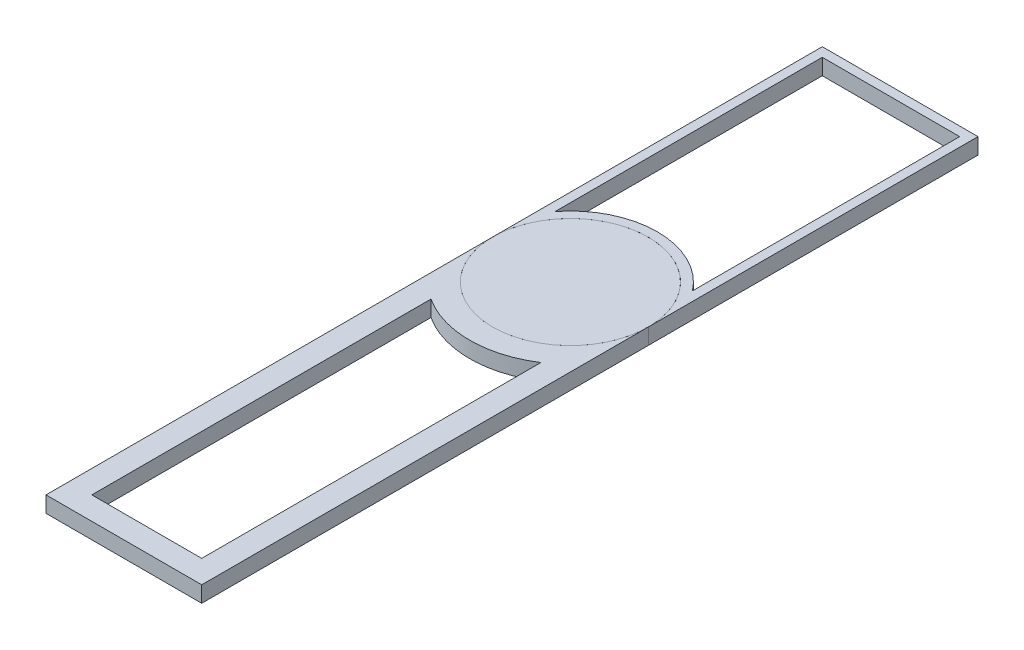
ISO-10303-21;
HEADER;
FILE_DESCRIPTION(('STEP AP214'),'2;1');
FILE_NAME('part.step','',(''),(''),'','','');
FILE_SCHEMA(('AUTOMOTIVE_DESIGN { 1 0 10303 214 1 1 1 1 }'));
ENDSEC;
DATA;
#1=APPLICATION_CONTEXT('core data for automotive mechanical design processes');
#2=APPLICATION_PROTOCOL_DEFINITION('international standard','automotive_design',2000,#1);
#3=PRODUCT_CONTEXT('',#1,'mechanical');
#4=PRODUCT('Part','Part','',(#3));
#5=PRODUCT_RELATED_PRODUCT_CATEGORY('part','',(#4));
#6=PRODUCT_DEFINITION_FORMATION('','',#4);
#7=PRODUCT_DEFINITION_CONTEXT('part definition',#1,'design');
#8=PRODUCT_DEFINITION('design','',#6,#7);
#9=PRODUCT_DEFINITION_SHAPE('','',#8);
#10=(LENGTH_UNIT() NAMED_UNIT(*) SI_UNIT(.MILLI.,.METRE.));
#11=(NAMED_UNIT(*) PLANE_ANGLE_UNIT() SI_UNIT($,.RADIAN.));
#12=(NAMED_UNIT(*) SI_UNIT($,.STERADIAN.) SOLID_ANGLE_UNIT());
#13=UNCERTAINTY_MEASURE_WITH_UNIT(LENGTH_MEASURE(1.E-05),#10,'distance_accuracy_value','');
#14=(GEOMETRIC_REPRESENTATION_CONTEXT(3) GLOBAL_UNCERTAINTY_ASSIGNED_CONTEXT((#13)) GLOBAL_UNIT_ASSIGNED_CONTEXT((#10,
#11,#12)) REPRESENTATION_CONTEXT('',''));
#15=CARTESIAN_POINT('',(0.,0.,0.));
#16=DIRECTION('',(0.,0.,1.));
#17=DIRECTION('',(1.,0.,0.));
#18=AXIS2_PLACEMENT_3D('',#15,#16,#17);
#19=CARTESIAN_POINT('',(17.,0.,-72.));
#20=DIRECTION('',(0.,1.,0.));
#21=DIRECTION('',(0.,0.,1.));
#22=AXIS2_PLACEMENT_3D('',#19,#20,#21);
#23=PLANE('',#22);
#24=DIRECTION('',(0.,0.,1.));
#25=VECTOR('',#24,1.);
#26=CARTESIAN_POINT('',(17.,0.,-72.));
#27=LINE('',#26,#25);
#28=CARTESIAN_POINT('',(17.,0.,-72.));
#29=VERTEX_POINT('',#28);
#30=CARTESIAN_POINT('',(17.,0.,0.));
#31=VERTEX_POINT('',#30);
#32=EDGE_CURVE('E12',#29,#31,#27,.T.);
#33=ORIENTED_EDGE('',*,*,#32,.T.);
#34=CARTESIAN_POINT('',(0.,0.,0.));
#35=DIRECTION('',(0.,-1.,0.));
#36=DIRECTION('',(0.,0.,-1.));
#37=AXIS2_PLACEMENT_3D('',#34,#35,#36);
#38=CIRCLE('',#37,17.);
#39=CARTESIAN_POINT('',(-17.,0.,0.));
#40=VERTEX_POINT('',#39);
#41=EDGE_CURVE('E152',#31,#40,#38,.F.);
#42=ORIENTED_EDGE('',*,*,#41,.T.);
#43=DIRECTION('',(0.,0.,1.));
#44=VECTOR('',#43,1.);
#45=CARTESIAN_POINT('',(-17.,0.,-72.));
#46=LINE('',#45,#44);
#47=CARTESIAN_POINT('',(-17.,0.,-72.));
#48=VERTEX_POINT('',#47);
#49=EDGE_CURVE('E64',#48,#40,#46,.T.);
#50=ORIENTED_EDGE('',*,*,#49,.F.);
#51=DIRECTION('',(-1.,0.,0.));
#52=VECTOR('',#51,1.);
#53=CARTESIAN_POINT('',(17.,0.,-72.));
#54=LINE('',#53,#52);
#55=EDGE_CURVE('E164',#29,#48,#54,.T.);
#56=ORIENTED_EDGE('',*,*,#55,.F.);
#57=EDGE_LOOP('',(#33,#42,#50,#56));
#58=FACE_BOUND('',#57,.T.);
#59=DIRECTION('',(0.,0.,1.));
#60=VECTOR('',#59,1.);
#61=CARTESIAN_POINT('',(15.,0.,-72.));
#62=LINE('',#61,#60);
#63=CARTESIAN_POINT('',(15.,0.,-70.));
#64=VERTEX_POINT('',#63);
#65=CARTESIAN_POINT('',(15.,0.,-11.6619037896906));
#66=VERTEX_POINT('',#65);
#67=EDGE_CURVE('E137',#64,#66,#62,.T.);
#68=ORIENTED_EDGE('',*,*,#67,.F.);
#69=DIRECTION('',(-1.,0.,0.));
#70=VECTOR('',#69,1.);
#71=CARTESIAN_POINT('',(0.,0.,-70.));
#72=LINE('',#71,#70);
#73=CARTESIAN_POINT('',(-15.,0.,-70.));
#74=VERTEX_POINT('',#73);
#75=EDGE_CURVE('E125',#64,#74,#72,.T.);
#76=ORIENTED_EDGE('',*,*,#75,.T.);
#77=DIRECTION('',(0.,0.,1.));
#78=VECTOR('',#77,1.);
#79=CARTESIAN_POINT('',(-15.,0.,-72.));
#80=LINE('',#79,#78);
#81=CARTESIAN_POINT('',(-15.,0.,-11.6619037896906));
#82=VERTEX_POINT('',#81);
#83=EDGE_CURVE('E122',#74,#82,#80,.T.);
#84=ORIENTED_EDGE('',*,*,#83,.T.);
#85=CARTESIAN_POINT('',(0.,0.,0.));
#86=DIRECTION('',(0.,1.,0.));
#87=DIRECTION('',(0.,0.,1.));
#88=AXIS2_PLACEMENT_3D('',#85,#86,#87);
#89=CIRCLE('',#88,19.);
#90=EDGE_CURVE('E145',#66,#82,#89,.T.);
#91=ORIENTED_EDGE('',*,*,#90,.F.);
#92=EDGE_LOOP('',(#68,#76,#84,#91));
#93=FACE_BOUND('',#92,.T.);
#94=ADVANCED_FACE('F56',(#58,#93),#23,.F.);
#95=CARTESIAN_POINT('',(17.,3.5,-72.));
#96=DIRECTION('',(0.,-1.,0.));
#97=DIRECTION('',(0.,0.,-1.));
#98=AXIS2_PLACEMENT_3D('',#95,#96,#97);
#99=PLANE('',#98);
#100=DIRECTION('',(0.,0.,1.));
#101=VECTOR('',#100,1.);
#102=CARTESIAN_POINT('',(-17.,3.5,-72.));
#103=LINE('',#102,#101);
#104=CARTESIAN_POINT('',(-17.,3.5,-72.));
#105=VERTEX_POINT('',#104);
#106=CARTESIAN_POINT('',(-17.,3.5,0.));
#107=VERTEX_POINT('',#106);
#108=EDGE_CURVE('E172',#105,#107,#103,.T.);
#109=ORIENTED_EDGE('',*,*,#108,.T.);
#110=CARTESIAN_POINT('',(0.,3.5,0.));
#111=DIRECTION('',(0.,1.,0.));
#112=DIRECTION('',(0.,0.,1.));
#113=AXIS2_PLACEMENT_3D('',#110,#111,#112);
#114=CIRCLE('',#113,17.);
#115=CARTESIAN_POINT('',(17.,3.5,0.));
#116=VERTEX_POINT('',#115);
#117=EDGE_CURVE('E156',#107,#116,#114,.F.);
#118=ORIENTED_EDGE('',*,*,#117,.T.);
#119=DIRECTION('',(0.,0.,1.));
#120=VECTOR('',#119,1.);
#121=CARTESIAN_POINT('',(17.,3.5,-72.));
#122=LINE('',#121,#120);
#123=CARTESIAN_POINT('',(17.,3.5,-72.));
#124=VERTEX_POINT('',#123);
#125=EDGE_CURVE('E170',#124,#116,#122,.T.);
#126=ORIENTED_EDGE('',*,*,#125,.F.);
#127=DIRECTION('',(1.,0.,0.));
#128=VECTOR('',#127,1.);
#129=CARTESIAN_POINT('',(17.,3.5,-72.));
#130=LINE('',#129,#128);
#131=EDGE_CURVE('E168',#105,#124,#130,.T.);
#132=ORIENTED_EDGE('',*,*,#131,.F.);
#133=EDGE_LOOP('',(#109,#118,#126,#132));
#134=FACE_BOUND('',#133,.T.);
#135=DIRECTION('',(0.,0.,1.));
#136=VECTOR('',#135,1.);
#137=CARTESIAN_POINT('',(-15.,3.5,-72.));
#138=LINE('',#137,#136);
#139=CARTESIAN_POINT('',(-15.,3.5,-70.));
#140=VERTEX_POINT('',#139);
#141=CARTESIAN_POINT('',(-15.,3.5,-11.6619037896906));
#142=VERTEX_POINT('',#141);
#143=EDGE_CURVE('E119',#140,#142,#138,.T.);
#144=ORIENTED_EDGE('',*,*,#143,.F.);
#145=DIRECTION('',(1.,0.,0.));
#146=VECTOR('',#145,1.);
#147=CARTESIAN_POINT('',(0.,3.5,-70.));
#148=LINE('',#147,#146);
#149=CARTESIAN_POINT('',(15.,3.5,-70.));
#150=VERTEX_POINT('',#149);
#151=EDGE_CURVE('E124',#140,#150,#148,.T.);
#152=ORIENTED_EDGE('',*,*,#151,.T.);
#153=DIRECTION('',(0.,0.,1.));
#154=VECTOR('',#153,1.);
#155=CARTESIAN_POINT('',(15.,3.5,-72.));
#156=LINE('',#155,#154);
#157=CARTESIAN_POINT('',(15.,3.5,-11.6619037896906));
#158=VERTEX_POINT('',#157);
#159=EDGE_CURVE('E131',#150,#158,#156,.T.);
#160=ORIENTED_EDGE('',*,*,#159,.T.);
#161=CARTESIAN_POINT('',(0.,3.5,0.));
#162=DIRECTION('',(0.,-1.,0.));
#163=DIRECTION('',(0.,0.,-1.));
#164=AXIS2_PLACEMENT_3D('',#161,#162,#163);
#165=CIRCLE('',#164,19.);
#166=EDGE_CURVE('E135',#142,#158,#165,.T.);
#167=ORIENTED_EDGE('',*,*,#166,.F.);
#168=EDGE_LOOP('',(#144,#152,#160,#167));
#169=FACE_BOUND('',#168,.T.);
#170=ADVANCED_FACE('F134',(#134,#169),#99,.F.);
#171=CARTESIAN_POINT('',(17.,0.,-72.));
#172=DIRECTION('',(-1.,0.,0.));
#173=DIRECTION('',(0.,0.,1.));
#174=AXIS2_PLACEMENT_3D('',#171,#172,#173);
#175=PLANE('',#174);
#176=ORIENTED_EDGE('',*,*,#125,.T.);
#177=DIRECTION('',(0.,-1.,0.));
#178=VECTOR('',#177,1.);
#179=CARTESIAN_POINT('',(17.,3.5,0.));
#180=LINE('',#179,#178);
#181=EDGE_CURVE('E144',#31,#116,#180,.F.);
#182=ORIENTED_EDGE('',*,*,#181,.F.);
#183=ORIENTED_EDGE('',*,*,#32,.F.);
#184=DIRECTION('',(0.,-1.,0.));
#185=VECTOR('',#184,1.);
#186=CARTESIAN_POINT('',(17.,0.,-72.));
#187=LINE('',#186,#185);
#188=EDGE_CURVE('E161',#124,#29,#187,.T.);
#189=ORIENTED_EDGE('',*,*,#188,.F.);
#190=EDGE_LOOP('',(#176,#182,#183,#189));
#191=FACE_BOUND('',#190,.T.);
#192=ADVANCED_FACE('F58',(#191),#175,.F.);
#193=CARTESIAN_POINT('',(-17.,0.,-72.));
#194=DIRECTION('',(1.,0.,0.));
#195=DIRECTION('',(0.,1.,0.));
#196=AXIS2_PLACEMENT_3D('',#193,#194,#195);
#197=PLANE('',#196);
#198=ORIENTED_EDGE('',*,*,#49,.T.);
#199=DIRECTION('',(0.,-1.,0.));
#200=VECTOR('',#199,1.);
#201=CARTESIAN_POINT('',(-17.,3.50000000000002,0.));
#202=LINE('',#201,#200);
#203=EDGE_CURVE('E153',#40,#107,#202,.F.);
#204=ORIENTED_EDGE('',*,*,#203,.T.);
#205=ORIENTED_EDGE('',*,*,#108,.F.);
#206=DIRECTION('',(0.,1.,0.));
#207=VECTOR('',#206,1.);
#208=CARTESIAN_POINT('',(-17.,0.,-72.));
#209=LINE('',#208,#207);
#210=EDGE_CURVE('E166',#48,#105,#209,.T.);
#211=ORIENTED_EDGE('',*,*,#210,.F.);
#212=EDGE_LOOP('',(#198,#204,#205,#211));
#213=FACE_BOUND('',#212,.T.);
#214=ADVANCED_FACE('F177',(#213),#197,.F.);
#215=CARTESIAN_POINT('',(0.,0.,-72.));
#216=DIRECTION('',(0.,0.,1.));
#217=DIRECTION('',(1.,0.,0.));
#218=AXIS2_PLACEMENT_3D('',#215,#216,#217);
#219=PLANE('',#218);
#220=ORIENTED_EDGE('',*,*,#188,.T.);
#221=ORIENTED_EDGE('',*,*,#55,.T.);
#222=ORIENTED_EDGE('',*,*,#210,.T.);
#223=ORIENTED_EDGE('',*,*,#131,.T.);
#224=EDGE_LOOP('',(#220,#221,#222,#223));
#225=FACE_BOUND('',#224,.T.);
#226=ADVANCED_FACE('F193',(#225),#219,.F.);
#227=CARTESIAN_POINT('',(0.,3.5,0.));
#228=DIRECTION('',(0.,-1.,0.));
#229=DIRECTION('',(0.,0.,-1.));
#230=AXIS2_PLACEMENT_3D('',#227,#228,#229);
#231=CYLINDRICAL_SURFACE('',#230,17.);
#232=ORIENTED_EDGE('',*,*,#41,.F.);
#233=ORIENTED_EDGE('',*,*,#181,.T.);
#234=ORIENTED_EDGE('',*,*,#117,.F.);
#235=ORIENTED_EDGE('',*,*,#203,.F.);
#236=EDGE_LOOP('',(#232,#233,#234,#235));
#237=FACE_BOUND('',#236,.T.);
#238=ADVANCED_FACE('F183',(#237),#231,.F.);
#239=CARTESIAN_POINT('',(15.,0.,-72.));
#240=DIRECTION('',(-1.,0.,0.));
#241=DIRECTION('',(0.,0.,1.));
#242=AXIS2_PLACEMENT_3D('',#239,#240,#241);
#243=PLANE('',#242);
#244=ORIENTED_EDGE('',*,*,#159,.F.);
#245=DIRECTION('',(0.,-1.,0.));
#246=VECTOR('',#245,1.);
#247=CARTESIAN_POINT('',(15.,0.,-70.));
#248=LINE('',#247,#246);
#249=EDGE_CURVE('E76',#150,#64,#248,.T.);
#250=ORIENTED_EDGE('',*,*,#249,.T.);
#251=ORIENTED_EDGE('',*,*,#67,.T.);
#252=DIRECTION('',(0.,-1.,0.));
#253=VECTOR('',#252,1.);
#254=CARTESIAN_POINT('',(15.,3.5,-11.6619037896906));
#255=LINE('',#254,#253);
#256=EDGE_CURVE('E147',#66,#158,#255,.F.);
#257=ORIENTED_EDGE('',*,*,#256,.T.);
#258=EDGE_LOOP('',(#244,#250,#251,#257));
#259=FACE_BOUND('',#258,.T.);
#260=ADVANCED_FACE('F200',(#259),#243,.T.);
#261=CARTESIAN_POINT('',(-15.,0.,-72.));
#262=DIRECTION('',(1.,0.,0.));
#263=DIRECTION('',(0.,1.,0.));
#264=AXIS2_PLACEMENT_3D('',#261,#262,#263);
#265=PLANE('',#264);
#266=ORIENTED_EDGE('',*,*,#83,.F.);
#267=DIRECTION('',(0.,1.,0.));
#268=VECTOR('',#267,1.);
#269=CARTESIAN_POINT('',(-15.,0.,-70.));
#270=LINE('',#269,#268);
#271=EDGE_CURVE('E71',#74,#140,#270,.T.);
#272=ORIENTED_EDGE('',*,*,#271,.T.);
#273=ORIENTED_EDGE('',*,*,#143,.T.);
#274=DIRECTION('',(0.,-1.,0.));
#275=VECTOR('',#274,1.);
#276=CARTESIAN_POINT('',(-15.,3.50000000000001,-11.6619037896906));
#277=LINE('',#276,#275);
#278=EDGE_CURVE('E142',#82,#142,#277,.F.);
#279=ORIENTED_EDGE('',*,*,#278,.F.);
#280=EDGE_LOOP('',(#266,#272,#273,#279));
#281=FACE_BOUND('',#280,.T.);
#282=ADVANCED_FACE('F117',(#281),#265,.T.);
#283=CARTESIAN_POINT('',(0.,0.,-70.));
#284=DIRECTION('',(0.,0.,1.));
#285=DIRECTION('',(1.,0.,0.));
#286=AXIS2_PLACEMENT_3D('',#283,#284,#285);
#287=PLANE('',#286);
#288=ORIENTED_EDGE('',*,*,#249,.F.);
#289=ORIENTED_EDGE('',*,*,#151,.F.);
#290=ORIENTED_EDGE('',*,*,#271,.F.);
#291=ORIENTED_EDGE('',*,*,#75,.F.);
#292=EDGE_LOOP('',(#288,#289,#290,#291));
#293=FACE_BOUND('',#292,.T.);
#294=ADVANCED_FACE('F128',(#293),#287,.T.);
#295=CARTESIAN_POINT('',(0.,3.5,0.));
#296=DIRECTION('',(0.,-1.,0.));
#297=DIRECTION('',(0.,0.,-1.));
#298=AXIS2_PLACEMENT_3D('',#295,#296,#297);
#299=CYLINDRICAL_SURFACE('',#298,19.);
#300=ORIENTED_EDGE('',*,*,#90,.T.);
#301=ORIENTED_EDGE('',*,*,#278,.T.);
#302=ORIENTED_EDGE('',*,*,#166,.T.);
#303=ORIENTED_EDGE('',*,*,#256,.F.);
#304=EDGE_LOOP('',(#300,#301,#302,#303));
#305=FACE_BOUND('',#304,.T.);
#306=ADVANCED_FACE('F266',(#305),#299,.T.);
#307=CLOSED_SHELL('',(#94,#170,#192,#214,#226,#238,#260,#282,#294,#306));
#308=MANIFOLD_SOLID_BREP('B2',#307);
#309=CARTESIAN_POINT('',(17.,3.5,-17.002));
#310=DIRECTION('',(0.,1.,0.));
#311=DIRECTION('',(-1.,0.,0.));
#312=AXIS2_PLACEMENT_3D('',#309,#310,#311);
#313=PLANE('',#312);
#314=CARTESIAN_POINT('',(0.,3.5,0.));
#315=DIRECTION('',(0.,1.,0.));
#316=DIRECTION('',(0.,0.,1.));
#317=AXIS2_PLACEMENT_3D('',#314,#315,#316);
#318=CIRCLE('',#317,17.);
#319=CARTESIAN_POINT('',(-17.,3.5,0.));
#320=VERTEX_POINT('',#319);
#321=CARTESIAN_POINT('',(17.,3.5,0.));
#322=VERTEX_POINT('',#321);
#323=EDGE_CURVE('E329',#320,#322,#318,.T.);
#324=ORIENTED_EDGE('',*,*,#323,.F.);
#325=DIRECTION('',(0.,0.,1.));
#326=VECTOR('',#325,1.);
#327=CARTESIAN_POINT('',(-17.,3.5,-17.002));
#328=LINE('',#327,#326);
#329=CARTESIAN_POINT('',(-17.,3.5,97.5));
#330=VERTEX_POINT('',#329);
#331=EDGE_CURVE('E450',#320,#330,#328,.T.);
#332=ORIENTED_EDGE('',*,*,#331,.T.);
#333=DIRECTION('',(-1.,0.,0.));
#334=VECTOR('',#333,1.);
#335=CARTESIAN_POINT('',(17.,3.5,97.5));
#336=LINE('',#335,#334);
#337=CARTESIAN_POINT('',(17.,3.5,97.5));
#338=VERTEX_POINT('',#337);
#339=EDGE_CURVE('E432',#338,#330,#336,.T.);
#340=ORIENTED_EDGE('',*,*,#339,.F.);
#341=DIRECTION('',(0.,0.,1.));
#342=VECTOR('',#341,1.);
#343=CARTESIAN_POINT('',(17.,3.5,-17.002));
#344=LINE('',#343,#342);
#345=EDGE_CURVE('E453',#322,#338,#344,.T.);
#346=ORIENTED_EDGE('',*,*,#345,.F.);
#347=EDGE_LOOP('',(#324,#332,#340,#346));
#348=FACE_BOUND('',#347,.T.);
#349=DIRECTION('',(0.,0.,1.));
#350=VECTOR('',#349,1.);
#351=CARTESIAN_POINT('',(-12.,3.5,-17.002));
#352=LINE('',#351,#350);
#353=CARTESIAN_POINT('',(-12.,3.5,18.4390889145858));
#354=VERTEX_POINT('',#353);
#355=CARTESIAN_POINT('',(-12.,3.5,92.5));
#356=VERTEX_POINT('',#355);
#357=EDGE_CURVE('E412',#354,#356,#352,.T.);
#358=ORIENTED_EDGE('',*,*,#357,.F.);
#359=CARTESIAN_POINT('',(0.,3.5,0.));
#360=DIRECTION('',(0.,1.,0.));
#361=DIRECTION('',(-1.,0.,0.));
#362=AXIS2_PLACEMENT_3D('',#359,#360,#361);
#363=CIRCLE('',#362,22.);
#364=CARTESIAN_POINT('',(12.,3.5,18.4390889145858));
#365=VERTEX_POINT('',#364);
#366=EDGE_CURVE('E393',#354,#365,#363,.T.);
#367=ORIENTED_EDGE('',*,*,#366,.T.);
#368=DIRECTION('',(0.,0.,1.));
#369=VECTOR('',#368,1.);
#370=CARTESIAN_POINT('',(12.,3.5,-17.002));
#371=LINE('',#370,#369);
#372=CARTESIAN_POINT('',(12.,3.5,92.5));
#373=VERTEX_POINT('',#372);
#374=EDGE_CURVE('E389',#365,#373,#371,.T.);
#375=ORIENTED_EDGE('',*,*,#374,.T.);
#376=DIRECTION('',(-1.,0.,0.));
#377=VECTOR('',#376,1.);
#378=CARTESIAN_POINT('',(17.,3.5,92.5));
#379=LINE('',#378,#377);
#380=EDGE_CURVE('E422',#373,#356,#379,.T.);
#381=ORIENTED_EDGE('',*,*,#380,.T.);
#382=EDGE_LOOP('',(#358,#367,#375,#381));
#383=FACE_BOUND('',#382,.T.);
#384=ADVANCED_FACE('F319',(#348,#383),#313,.T.);
#385=CARTESIAN_POINT('',(17.,0.,-17.002));
#386=DIRECTION('',(0.,-1.,0.));
#387=DIRECTION('',(0.,0.,-1.));
#388=AXIS2_PLACEMENT_3D('',#385,#386,#387);
#389=PLANE('',#388);
#390=DIRECTION('',(0.,0.,1.));
#391=VECTOR('',#390,1.);
#392=CARTESIAN_POINT('',(-17.,0.,-17.002));
#393=LINE('',#392,#391);
#394=CARTESIAN_POINT('',(-17.,0.,0.));
#395=VERTEX_POINT('',#394);
#396=CARTESIAN_POINT('',(-17.,0.,97.5));
#397=VERTEX_POINT('',#396);
#398=EDGE_CURVE('E447',#395,#397,#393,.T.);
#399=ORIENTED_EDGE('',*,*,#398,.F.);
#400=CARTESIAN_POINT('',(0.,0.,0.));
#401=DIRECTION('',(0.,1.,0.));
#402=DIRECTION('',(0.,0.,1.));
#403=AXIS2_PLACEMENT_3D('',#400,#401,#402);
#404=CIRCLE('',#403,17.);
#405=CARTESIAN_POINT('',(17.,0.,0.));
#406=VERTEX_POINT('',#405);
#407=EDGE_CURVE('E456',#395,#406,#404,.T.);
#408=ORIENTED_EDGE('',*,*,#407,.T.);
#409=DIRECTION('',(0.,0.,1.));
#410=VECTOR('',#409,1.);
#411=CARTESIAN_POINT('',(17.,0.,-17.002));
#412=LINE('',#411,#410);
#413=CARTESIAN_POINT('',(17.,0.,97.5));
#414=VERTEX_POINT('',#413);
#415=EDGE_CURVE('E444',#406,#414,#412,.T.);
#416=ORIENTED_EDGE('',*,*,#415,.T.);
#417=DIRECTION('',(1.,0.,0.));
#418=VECTOR('',#417,1.);
#419=CARTESIAN_POINT('',(17.,0.,97.5));
#420=LINE('',#419,#418);
#421=EDGE_CURVE('E440',#397,#414,#420,.T.);
#422=ORIENTED_EDGE('',*,*,#421,.F.);
#423=EDGE_LOOP('',(#399,#408,#416,#422));
#424=FACE_BOUND('',#423,.T.);
#425=CARTESIAN_POINT('',(0.,0.,0.));
#426=DIRECTION('',(0.,-1.,0.));
#427=DIRECTION('',(0.,0.,-1.));
#428=AXIS2_PLACEMENT_3D('',#425,#426,#427);
#429=CIRCLE('',#428,22.);
#430=CARTESIAN_POINT('',(-12.,0.,18.4390889145858));
#431=VERTEX_POINT('',#430);
#432=CARTESIAN_POINT('',(12.,0.,18.4390889145858));
#433=VERTEX_POINT('',#432);
#434=EDGE_CURVE('E394',#431,#433,#429,.F.);
#435=ORIENTED_EDGE('',*,*,#434,.F.);
#436=DIRECTION('',(0.,0.,1.));
#437=VECTOR('',#436,1.);
#438=CARTESIAN_POINT('',(-12.,0.,-17.002));
#439=LINE('',#438,#437);
#440=CARTESIAN_POINT('',(-12.,0.,92.5));
#441=VERTEX_POINT('',#440);
#442=EDGE_CURVE('E408',#431,#441,#439,.T.);
#443=ORIENTED_EDGE('',*,*,#442,.T.);
#444=DIRECTION('',(1.,0.,0.));
#445=VECTOR('',#444,1.);
#446=CARTESIAN_POINT('',(17.,0.,92.5));
#447=LINE('',#446,#445);
#448=CARTESIAN_POINT('',(12.,0.,92.5));
#449=VERTEX_POINT('',#448);
#450=EDGE_CURVE('E406',#441,#449,#447,.T.);
#451=ORIENTED_EDGE('',*,*,#450,.T.);
#452=DIRECTION('',(0.,0.,1.));
#453=VECTOR('',#452,1.);
#454=CARTESIAN_POINT('',(12.,0.,-17.002));
#455=LINE('',#454,#453);
#456=EDGE_CURVE('E386',#433,#449,#455,.T.);
#457=ORIENTED_EDGE('',*,*,#456,.F.);
#458=EDGE_LOOP('',(#435,#443,#451,#457));
#459=FACE_BOUND('',#458,.T.);
#460=ADVANCED_FACE('F405',(#424,#459),#389,.T.);
#461=CARTESIAN_POINT('',(0.,3.5,0.));
#462=DIRECTION('',(0.,-1.,0.));
#463=DIRECTION('',(0.,0.,-1.));
#464=AXIS2_PLACEMENT_3D('',#461,#462,#463);
#465=CYLINDRICAL_SURFACE('',#464,17.);
#466=ORIENTED_EDGE('',*,*,#407,.F.);
#467=DIRECTION('',(0.,-1.,0.));
#468=VECTOR('',#467,1.);
#469=CARTESIAN_POINT('',(-17.,3.5,0.));
#470=LINE('',#469,#468);
#471=EDGE_CURVE('E54',#395,#320,#470,.F.);
#472=ORIENTED_EDGE('',*,*,#471,.T.);
#473=ORIENTED_EDGE('',*,*,#323,.T.);
#474=DIRECTION('',(0.,-1.,0.));
#475=VECTOR('',#474,1.);
#476=CARTESIAN_POINT('',(17.,3.5,0.));
#477=LINE('',#476,#475);
#478=EDGE_CURVE('E323',#406,#322,#477,.F.);
#479=ORIENTED_EDGE('',*,*,#478,.F.);
#480=EDGE_LOOP('',(#466,#472,#473,#479));
#481=FACE_BOUND('',#480,.T.);
#482=ADVANCED_FACE('F321',(#481),#465,.F.);
#483=CARTESIAN_POINT('',(17.,3.5,-17.002));
#484=DIRECTION('',(1.,0.,0.));
#485=DIRECTION('',(0.,0.,-1.));
#486=AXIS2_PLACEMENT_3D('',#483,#484,#485);
#487=PLANE('',#486);
#488=ORIENTED_EDGE('',*,*,#415,.F.);
#489=ORIENTED_EDGE('',*,*,#478,.T.);
#490=ORIENTED_EDGE('',*,*,#345,.T.);
#491=DIRECTION('',(0.,1.,0.));
#492=VECTOR('',#491,1.);
#493=CARTESIAN_POINT('',(17.,3.5,97.5));
#494=LINE('',#493,#492);
#495=EDGE_CURVE('E428',#414,#338,#494,.T.);
#496=ORIENTED_EDGE('',*,*,#495,.F.);
#497=EDGE_LOOP('',(#488,#489,#490,#496));
#498=FACE_BOUND('',#497,.T.);
#499=ADVANCED_FACE('F468',(#498),#487,.T.);
#500=CARTESIAN_POINT('',(-17.,3.5,-17.002));
#501=DIRECTION('',(-1.,0.,0.));
#502=DIRECTION('',(0.,0.,1.));
#503=AXIS2_PLACEMENT_3D('',#500,#501,#502);
#504=PLANE('',#503);
#505=ORIENTED_EDGE('',*,*,#471,.F.);
#506=ORIENTED_EDGE('',*,*,#398,.T.);
#507=DIRECTION('',(0.,-1.,0.));
#508=VECTOR('',#507,1.);
#509=CARTESIAN_POINT('',(-17.,3.5,97.5));
#510=LINE('',#509,#508);
#511=EDGE_CURVE('E436',#330,#397,#510,.T.);
#512=ORIENTED_EDGE('',*,*,#511,.F.);
#513=ORIENTED_EDGE('',*,*,#331,.F.);
#514=EDGE_LOOP('',(#505,#506,#512,#513));
#515=FACE_BOUND('',#514,.T.);
#516=ADVANCED_FACE('F481',(#515),#504,.T.);
#517=CARTESIAN_POINT('',(0.,0.,97.5));
#518=DIRECTION('',(0.,0.,-1.));
#519=DIRECTION('',(-1.,0.,0.));
#520=AXIS2_PLACEMENT_3D('',#517,#518,#519);
#521=PLANE('',#520);
#522=ORIENTED_EDGE('',*,*,#495,.T.);
#523=ORIENTED_EDGE('',*,*,#339,.T.);
#524=ORIENTED_EDGE('',*,*,#511,.T.);
#525=ORIENTED_EDGE('',*,*,#421,.T.);
#526=EDGE_LOOP('',(#522,#523,#524,#525));
#527=FACE_BOUND('',#526,.T.);
#528=ADVANCED_FACE('F478',(#527),#521,.F.);
#529=CARTESIAN_POINT('',(0.,3.5,0.));
#530=DIRECTION('',(0.,-1.,0.));
#531=DIRECTION('',(0.,0.,-1.));
#532=AXIS2_PLACEMENT_3D('',#529,#530,#531);
#533=CYLINDRICAL_SURFACE('',#532,22.);
#534=ORIENTED_EDGE('',*,*,#434,.T.);
#535=DIRECTION('',(0.,-1.,0.));
#536=VECTOR('',#535,1.);
#537=CARTESIAN_POINT('',(12.,3.5,18.4390889145858));
#538=LINE('',#537,#536);
#539=EDGE_CURVE('E382',#433,#365,#538,.F.);
#540=ORIENTED_EDGE('',*,*,#539,.T.);
#541=ORIENTED_EDGE('',*,*,#366,.F.);
#542=DIRECTION('',(0.,-1.,0.));
#543=VECTOR('',#542,1.);
#544=CARTESIAN_POINT('',(-12.,3.5,18.4390889145858));
#545=LINE('',#544,#543);
#546=EDGE_CURVE('E399',#431,#354,#545,.F.);
#547=ORIENTED_EDGE('',*,*,#546,.F.);
#548=EDGE_LOOP('',(#534,#540,#541,#547));
#549=FACE_BOUND('',#548,.T.);
#550=ADVANCED_FACE('F397',(#549),#533,.T.);
#551=CARTESIAN_POINT('',(12.,3.5,-17.002));
#552=DIRECTION('',(1.,0.,0.));
#553=DIRECTION('',(0.,0.,-1.));
#554=AXIS2_PLACEMENT_3D('',#551,#552,#553);
#555=PLANE('',#554);
#556=ORIENTED_EDGE('',*,*,#456,.T.);
#557=DIRECTION('',(0.,1.,0.));
#558=VECTOR('',#557,1.);
#559=CARTESIAN_POINT('',(12.,3.5,92.5));
#560=LINE('',#559,#558);
#561=EDGE_CURVE('E336',#449,#373,#560,.T.);
#562=ORIENTED_EDGE('',*,*,#561,.T.);
#563=ORIENTED_EDGE('',*,*,#374,.F.);
#564=ORIENTED_EDGE('',*,*,#539,.F.);
#565=EDGE_LOOP('',(#556,#562,#563,#564));
#566=FACE_BOUND('',#565,.T.);
#567=ADVANCED_FACE('F384',(#566),#555,.F.);
#568=CARTESIAN_POINT('',(-12.,3.5,-17.002));
#569=DIRECTION('',(-1.,0.,0.));
#570=DIRECTION('',(0.,0.,1.));
#571=AXIS2_PLACEMENT_3D('',#568,#569,#570);
#572=PLANE('',#571);
#573=ORIENTED_EDGE('',*,*,#546,.T.);
#574=ORIENTED_EDGE('',*,*,#357,.T.);
#575=DIRECTION('',(0.,-1.,0.));
#576=VECTOR('',#575,1.);
#577=CARTESIAN_POINT('',(-12.,3.5,92.5));
#578=LINE('',#577,#576);
#579=EDGE_CURVE('E414',#356,#441,#578,.T.);
#580=ORIENTED_EDGE('',*,*,#579,.T.);
#581=ORIENTED_EDGE('',*,*,#442,.F.);
#582=EDGE_LOOP('',(#573,#574,#580,#581));
#583=FACE_BOUND('',#582,.T.);
#584=ADVANCED_FACE('F500',(#583),#572,.F.);
#585=CARTESIAN_POINT('',(0.,0.,92.5));
#586=DIRECTION('',(0.,0.,-1.));
#587=DIRECTION('',(-1.,0.,0.));
#588=AXIS2_PLACEMENT_3D('',#585,#586,#587);
#589=PLANE('',#588);
#590=ORIENTED_EDGE('',*,*,#561,.F.);
#591=ORIENTED_EDGE('',*,*,#450,.F.);
#592=ORIENTED_EDGE('',*,*,#579,.F.);
#593=ORIENTED_EDGE('',*,*,#380,.F.);
#594=EDGE_LOOP('',(#590,#591,#592,#593));
#595=FACE_BOUND('',#594,.T.);
#596=ADVANCED_FACE('F497',(#595),#589,.T.);
#597=CLOSED_SHELL('',(#384,#460,#482,#499,#516,#528,#550,#567,#584,#596));
#598=MANIFOLD_SOLID_BREP('B6',#597);
#599=CARTESIAN_POINT('',(0.,3.5,0.));
#600=DIRECTION('',(0.,-1.,0.));
#601=DIRECTION('',(0.,0.,-1.));
#602=AXIS2_PLACEMENT_3D('',#599,#600,#601);
#603=CYLINDRICAL_SURFACE('',#602,17.);
#604=CARTESIAN_POINT('',(0.,3.5,0.));
#605=DIRECTION('',(0.,1.,0.));
#606=DIRECTION('',(0.,0.,1.));
#607=AXIS2_PLACEMENT_3D('',#604,#605,#606);
#608=CIRCLE('',#607,17.);
#609=CARTESIAN_POINT('',(0.,3.5,17.));
#610=VERTEX_POINT('',#609);
#611=EDGE_CURVE('E318',#610,#610,#608,.T.);
#612=ORIENTED_EDGE('',*,*,#611,.F.);
#613=EDGE_LOOP('',(#612));
#614=FACE_BOUND('',#613,.T.);
#615=CARTESIAN_POINT('',(0.,0.,0.));
#616=DIRECTION('',(0.,1.,0.));
#617=DIRECTION('',(0.,0.,1.));
#618=AXIS2_PLACEMENT_3D('',#615,#616,#617);
#619=CIRCLE('',#618,17.);
#620=CARTESIAN_POINT('',(0.,0.,17.));
#621=VERTEX_POINT('',#620);
#622=EDGE_CURVE('E627',#621,#621,#619,.T.);
#623=ORIENTED_EDGE('',*,*,#622,.T.);
#624=EDGE_LOOP('',(#623));
#625=FACE_BOUND('',#624,.T.);
#626=ADVANCED_FACE('F624',(#614,#625),#603,.T.);
#627=CARTESIAN_POINT('',(0.,3.5,0.));
#628=DIRECTION('',(0.,1.,0.));
#629=DIRECTION('',(0.,0.,1.));
#630=AXIS2_PLACEMENT_3D('',#627,#628,#629);
#631=PLANE('',#630);
#632=ORIENTED_EDGE('',*,*,#611,.T.);
#633=EDGE_LOOP('',(#632));
#634=FACE_BOUND('',#633,.T.);
#635=ADVANCED_FACE('F639',(#634),#631,.T.);
#636=CARTESIAN_POINT('',(0.,0.,0.));
#637=DIRECTION('',(0.,1.,0.));
#638=DIRECTION('',(0.,0.,1.));
#639=AXIS2_PLACEMENT_3D('',#636,#637,#638);
#640=PLANE('',#639);
#641=ORIENTED_EDGE('',*,*,#622,.F.);
#642=EDGE_LOOP('',(#641));
#643=FACE_BOUND('',#642,.T.);
#644=ADVANCED_FACE('F637',(#643),#640,.F.);
#645=CLOSED_SHELL('',(#626,#635,#644));
#646=MANIFOLD_SOLID_BREP('B48',#645);
#647=ADVANCED_BREP_SHAPE_REPRESENTATION('',(#18,#308,#598,#646),#14);
#648=SHAPE_DEFINITION_REPRESENTATION(#9,#647);
ENDSEC;
END-ISO-10303-21;
